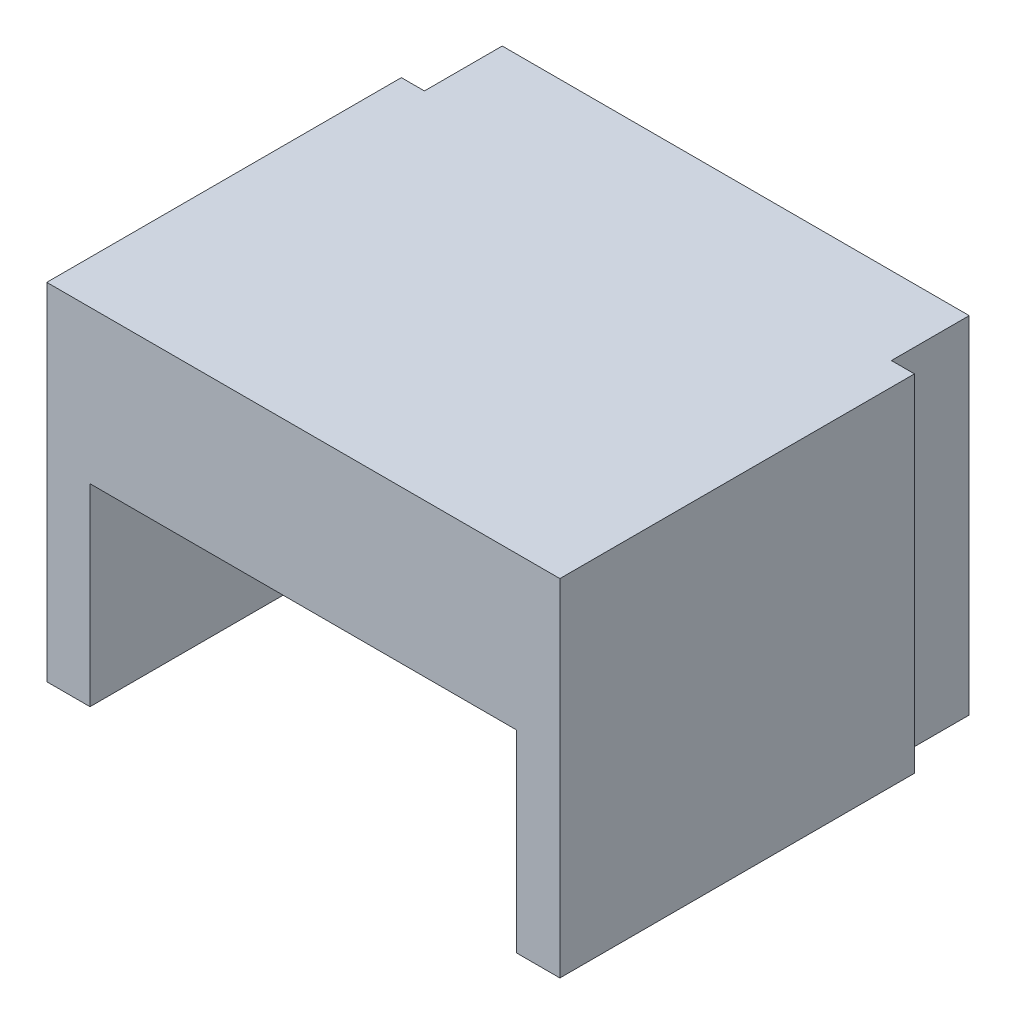
ISO-10303-21;
HEADER;
FILE_DESCRIPTION(('STEP AP214'),'2;1');
FILE_NAME('part.step','',(''),(''),'','','');
FILE_SCHEMA(('AUTOMOTIVE_DESIGN { 1 0 10303 214 1 1 1 1 }'));
ENDSEC;
DATA;
#1=APPLICATION_CONTEXT('core data for automotive mechanical design processes');
#2=APPLICATION_PROTOCOL_DEFINITION('international standard','automotive_design',2000,#1);
#3=PRODUCT_CONTEXT('',#1,'mechanical');
#4=PRODUCT('Part','Part','',(#3));
#5=PRODUCT_RELATED_PRODUCT_CATEGORY('part','',(#4));
#6=PRODUCT_DEFINITION_FORMATION('','',#4);
#7=PRODUCT_DEFINITION_CONTEXT('part definition',#1,'design');
#8=PRODUCT_DEFINITION('design','',#6,#7);
#9=PRODUCT_DEFINITION_SHAPE('','',#8);
#10=(LENGTH_UNIT() NAMED_UNIT(*) SI_UNIT(.MILLI.,.METRE.));
#11=(NAMED_UNIT(*) PLANE_ANGLE_UNIT() SI_UNIT($,.RADIAN.));
#12=(NAMED_UNIT(*) SI_UNIT($,.STERADIAN.) SOLID_ANGLE_UNIT());
#13=UNCERTAINTY_MEASURE_WITH_UNIT(LENGTH_MEASURE(1.E-05),#10,'distance_accuracy_value','');
#14=(GEOMETRIC_REPRESENTATION_CONTEXT(3) GLOBAL_UNCERTAINTY_ASSIGNED_CONTEXT((#13)) GLOBAL_UNIT_ASSIGNED_CONTEXT((#10,
#11,#12)) REPRESENTATION_CONTEXT('',''));
#15=CARTESIAN_POINT('',(0.,0.,0.));
#16=DIRECTION('',(0.,0.,1.));
#17=DIRECTION('',(1.,0.,0.));
#18=AXIS2_PLACEMENT_3D('',#15,#16,#17);
#19=CARTESIAN_POINT('',(0.,0.,15.));
#20=DIRECTION('',(0.,1.,0.));
#21=DIRECTION('',(0.,0.,1.));
#22=AXIS2_PLACEMENT_3D('',#19,#20,#21);
#23=PLANE('',#22);
#24=DIRECTION('',(-1.,0.,0.));
#25=VECTOR('',#24,1.);
#26=CARTESIAN_POINT('',(17.8,0.,2.7));
#27=LINE('',#26,#25);
#28=CARTESIAN_POINT('',(17.8,0.,2.7));
#29=VERTEX_POINT('',#28);
#30=CARTESIAN_POINT('',(17.,0.,2.7));
#31=VERTEX_POINT('',#30);
#32=EDGE_CURVE('E151',#29,#31,#27,.T.);
#33=ORIENTED_EDGE('',*,*,#32,.F.);
#34=DIRECTION('',(0.,0.,-1.));
#35=VECTOR('',#34,1.);
#36=CARTESIAN_POINT('',(17.8,0.,15.));
#37=LINE('',#36,#35);
#38=CARTESIAN_POINT('',(17.8,0.,15.));
#39=VERTEX_POINT('',#38);
#40=EDGE_CURVE('E51',#39,#29,#37,.T.);
#41=ORIENTED_EDGE('',*,*,#40,.F.);
#42=DIRECTION('',(1.,0.,0.));
#43=VECTOR('',#42,1.);
#44=CARTESIAN_POINT('',(0.,0.,15.));
#45=LINE('',#44,#43);
#46=CARTESIAN_POINT('',(16.3,0.,15.));
#47=VERTEX_POINT('',#46);
#48=EDGE_CURVE('E226',#47,#39,#45,.T.);
#49=ORIENTED_EDGE('',*,*,#48,.F.);
#50=DIRECTION('',(0.,0.,1.));
#51=VECTOR('',#50,1.);
#52=CARTESIAN_POINT('',(16.3,0.,0.));
#53=LINE('',#52,#51);
#54=CARTESIAN_POINT('',(16.3,0.,0.));
#55=VERTEX_POINT('',#54);
#56=EDGE_CURVE('E225',#55,#47,#53,.T.);
#57=ORIENTED_EDGE('',*,*,#56,.F.);
#58=DIRECTION('',(1.,0.,0.));
#59=VECTOR('',#58,1.);
#60=CARTESIAN_POINT('',(0.,0.,0.));
#61=LINE('',#60,#59);
#62=CARTESIAN_POINT('',(17.,0.,0.));
#63=VERTEX_POINT('',#62);
#64=EDGE_CURVE('E164',#55,#63,#61,.T.);
#65=ORIENTED_EDGE('',*,*,#64,.T.);
#66=DIRECTION('',(0.,0.,-1.));
#67=VECTOR('',#66,1.);
#68=CARTESIAN_POINT('',(17.,0.,2.7));
#69=LINE('',#68,#67);
#70=EDGE_CURVE('E144',#31,#63,#69,.T.);
#71=ORIENTED_EDGE('',*,*,#70,.F.);
#72=EDGE_LOOP('',(#33,#41,#49,#57,#65,#71));
#73=FACE_BOUND('',#72,.T.);
#74=ADVANCED_FACE('F43',(#73),#23,.F.);
#75=CARTESIAN_POINT('',(0.,0.,15.));
#76=DIRECTION('',(1.,0.,0.));
#77=DIRECTION('',(0.,0.,-1.));
#78=AXIS2_PLACEMENT_3D('',#75,#76,#77);
#79=PLANE('',#78);
#80=DIRECTION('',(0.,1.,0.));
#81=VECTOR('',#80,1.);
#82=CARTESIAN_POINT('',(0.,12.,2.7));
#83=LINE('',#82,#81);
#84=CARTESIAN_POINT('',(0.,0.,2.7));
#85=VERTEX_POINT('',#84);
#86=CARTESIAN_POINT('',(0.,12.,2.7));
#87=VERTEX_POINT('',#86);
#88=EDGE_CURVE('E171',#85,#87,#83,.T.);
#89=ORIENTED_EDGE('',*,*,#88,.F.);
#90=DIRECTION('',(0.,0.,-1.));
#91=VECTOR('',#90,1.);
#92=CARTESIAN_POINT('',(0.,0.,15.));
#93=LINE('',#92,#91);
#94=CARTESIAN_POINT('',(0.,0.,15.));
#95=VERTEX_POINT('',#94);
#96=EDGE_CURVE('E11',#95,#85,#93,.T.);
#97=ORIENTED_EDGE('',*,*,#96,.F.);
#98=DIRECTION('',(0.,-1.,0.));
#99=VECTOR('',#98,1.);
#100=CARTESIAN_POINT('',(0.,0.,15.));
#101=LINE('',#100,#99);
#102=CARTESIAN_POINT('',(0.,12.,15.));
#103=VERTEX_POINT('',#102);
#104=EDGE_CURVE('E227',#103,#95,#101,.T.);
#105=ORIENTED_EDGE('',*,*,#104,.F.);
#106=DIRECTION('',(0.,0.,-1.));
#107=VECTOR('',#106,1.);
#108=CARTESIAN_POINT('',(0.,12.,15.));
#109=LINE('',#108,#107);
#110=EDGE_CURVE('E236',#103,#87,#109,.T.);
#111=ORIENTED_EDGE('',*,*,#110,.T.);
#112=EDGE_LOOP('',(#89,#97,#105,#111));
#113=FACE_BOUND('',#112,.T.);
#114=ADVANCED_FACE('F44',(#113),#79,.F.);
#115=CARTESIAN_POINT('',(17.8,0.,15.));
#116=DIRECTION('',(-1.,0.,0.));
#117=DIRECTION('',(0.,0.,1.));
#118=AXIS2_PLACEMENT_3D('',#115,#116,#117);
#119=PLANE('',#118);
#120=DIRECTION('',(0.,-1.,0.));
#121=VECTOR('',#120,1.);
#122=CARTESIAN_POINT('',(17.8,12.,2.7));
#123=LINE('',#122,#121);
#124=CARTESIAN_POINT('',(17.8,12.,2.7));
#125=VERTEX_POINT('',#124);
#126=EDGE_CURVE('E156',#125,#29,#123,.T.);
#127=ORIENTED_EDGE('',*,*,#126,.F.);
#128=DIRECTION('',(0.,0.,-1.));
#129=VECTOR('',#128,1.);
#130=CARTESIAN_POINT('',(17.8,12.,15.));
#131=LINE('',#130,#129);
#132=CARTESIAN_POINT('',(17.8,12.,15.));
#133=VERTEX_POINT('',#132);
#134=EDGE_CURVE('E243',#133,#125,#131,.T.);
#135=ORIENTED_EDGE('',*,*,#134,.F.);
#136=DIRECTION('',(0.,1.,0.));
#137=VECTOR('',#136,1.);
#138=CARTESIAN_POINT('',(17.8,0.,15.));
#139=LINE('',#138,#137);
#140=EDGE_CURVE('E233',#39,#133,#139,.T.);
#141=ORIENTED_EDGE('',*,*,#140,.F.);
#142=ORIENTED_EDGE('',*,*,#40,.T.);
#143=EDGE_LOOP('',(#127,#135,#141,#142));
#144=FACE_BOUND('',#143,.T.);
#145=ADVANCED_FACE('F248',(#144),#119,.F.);
#146=CARTESIAN_POINT('',(0.,12.,15.));
#147=DIRECTION('',(0.,-1.,0.));
#148=DIRECTION('',(0.,0.,-1.));
#149=AXIS2_PLACEMENT_3D('',#146,#147,#148);
#150=PLANE('',#149);
#151=DIRECTION('',(1.,0.,0.));
#152=VECTOR('',#151,1.);
#153=CARTESIAN_POINT('',(17.8,12.,2.7));
#154=LINE('',#153,#152);
#155=CARTESIAN_POINT('',(17.,12.,2.7));
#156=VERTEX_POINT('',#155);
#157=EDGE_CURVE('E147',#156,#125,#154,.T.);
#158=ORIENTED_EDGE('',*,*,#157,.F.);
#159=DIRECTION('',(0.,0.,-1.));
#160=VECTOR('',#159,1.);
#161=CARTESIAN_POINT('',(17.,12.,2.7));
#162=LINE('',#161,#160);
#163=CARTESIAN_POINT('',(17.,12.,0.));
#164=VERTEX_POINT('',#163);
#165=EDGE_CURVE('E146',#156,#164,#162,.T.);
#166=ORIENTED_EDGE('',*,*,#165,.T.);
#167=DIRECTION('',(-1.,0.,0.));
#168=VECTOR('',#167,1.);
#169=CARTESIAN_POINT('',(0.,12.,0.));
#170=LINE('',#169,#168);
#171=CARTESIAN_POINT('',(0.800000000000002,12.,0.));
#172=VERTEX_POINT('',#171);
#173=EDGE_CURVE('E228',#164,#172,#170,.T.);
#174=ORIENTED_EDGE('',*,*,#173,.T.);
#175=DIRECTION('',(0.,0.,-1.));
#176=VECTOR('',#175,1.);
#177=CARTESIAN_POINT('',(0.800000000000002,12.,2.7));
#178=LINE('',#177,#176);
#179=CARTESIAN_POINT('',(0.800000000000002,12.,2.7));
#180=VERTEX_POINT('',#179);
#181=EDGE_CURVE('E175',#180,#172,#178,.T.);
#182=ORIENTED_EDGE('',*,*,#181,.F.);
#183=DIRECTION('',(1.,0.,0.));
#184=VECTOR('',#183,1.);
#185=CARTESIAN_POINT('',(0.,12.,2.7));
#186=LINE('',#185,#184);
#187=EDGE_CURVE('E66',#87,#180,#186,.T.);
#188=ORIENTED_EDGE('',*,*,#187,.F.);
#189=ORIENTED_EDGE('',*,*,#110,.F.);
#190=DIRECTION('',(-1.,0.,0.));
#191=VECTOR('',#190,1.);
#192=CARTESIAN_POINT('',(0.,12.,15.));
#193=LINE('',#192,#191);
#194=EDGE_CURVE('E237',#133,#103,#193,.T.);
#195=ORIENTED_EDGE('',*,*,#194,.F.);
#196=ORIENTED_EDGE('',*,*,#134,.T.);
#197=EDGE_LOOP('',(#158,#166,#174,#182,#188,#189,#195,#196));
#198=FACE_BOUND('',#197,.T.);
#199=ADVANCED_FACE('F270',(#198),#150,.F.);
#200=CARTESIAN_POINT('',(1.5,0.,0.));
#201=DIRECTION('',(-1.,0.,0.));
#202=DIRECTION('',(0.,0.,1.));
#203=AXIS2_PLACEMENT_3D('',#200,#201,#202);
#204=PLANE('',#203);
#205=DIRECTION('',(0.,1.,0.));
#206=VECTOR('',#205,1.);
#207=CARTESIAN_POINT('',(1.5,6.7,3.55001510292752));
#208=LINE('',#207,#206);
#209=CARTESIAN_POINT('',(1.5,6.7,3.55001510292752));
#210=VERTEX_POINT('',#209);
#211=CARTESIAN_POINT('',(1.5,7.5,3.55001510292752));
#212=VERTEX_POINT('',#211);
#213=EDGE_CURVE('E200',#210,#212,#208,.T.);
#214=ORIENTED_EDGE('',*,*,#213,.F.);
#215=DIRECTION('',(0.,0.,-1.));
#216=VECTOR('',#215,1.);
#217=CARTESIAN_POINT('',(1.5,6.7,15.));
#218=LINE('',#217,#216);
#219=CARTESIAN_POINT('',(1.5,6.7,15.));
#220=VERTEX_POINT('',#219);
#221=EDGE_CURVE('E187',#220,#210,#218,.T.);
#222=ORIENTED_EDGE('',*,*,#221,.F.);
#223=DIRECTION('',(0.,-1.,0.));
#224=VECTOR('',#223,1.);
#225=CARTESIAN_POINT('',(1.5,0.,15.));
#226=LINE('',#225,#224);
#227=CARTESIAN_POINT('',(1.5,0.,15.));
#228=VERTEX_POINT('',#227);
#229=EDGE_CURVE('E203',#220,#228,#226,.T.);
#230=ORIENTED_EDGE('',*,*,#229,.T.);
#231=DIRECTION('',(0.,0.,1.));
#232=VECTOR('',#231,1.);
#233=CARTESIAN_POINT('',(1.5,0.,0.));
#234=LINE('',#233,#232);
#235=CARTESIAN_POINT('',(1.5,0.,0.));
#236=VERTEX_POINT('',#235);
#237=EDGE_CURVE('E215',#236,#228,#234,.T.);
#238=ORIENTED_EDGE('',*,*,#237,.F.);
#239=DIRECTION('',(0.,-1.,0.));
#240=VECTOR('',#239,1.);
#241=CARTESIAN_POINT('',(1.5,0.,0.));
#242=LINE('',#241,#240);
#243=CARTESIAN_POINT('',(1.5,7.5,0.));
#244=VERTEX_POINT('',#243);
#245=EDGE_CURVE('E205',#244,#236,#242,.T.);
#246=ORIENTED_EDGE('',*,*,#245,.F.);
#247=DIRECTION('',(0.,0.,1.));
#248=VECTOR('',#247,1.);
#249=CARTESIAN_POINT('',(1.5,7.5,0.));
#250=LINE('',#249,#248);
#251=EDGE_CURVE('E216',#244,#212,#250,.T.);
#252=ORIENTED_EDGE('',*,*,#251,.T.);
#253=EDGE_LOOP('',(#214,#222,#230,#238,#246,#252));
#254=FACE_BOUND('',#253,.T.);
#255=ADVANCED_FACE('F282',(#254),#204,.F.);
#256=CARTESIAN_POINT('',(1.5,7.5,0.));
#257=DIRECTION('',(0.,1.,0.));
#258=DIRECTION('',(-1.,0.,0.));
#259=AXIS2_PLACEMENT_3D('',#256,#257,#258);
#260=PLANE('',#259);
#261=DIRECTION('',(1.,0.,0.));
#262=VECTOR('',#261,1.);
#263=CARTESIAN_POINT('',(1.5,7.5,3.55001510292752));
#264=LINE('',#263,#262);
#265=CARTESIAN_POINT('',(16.3,7.5,3.55001510292752));
#266=VERTEX_POINT('',#265);
#267=EDGE_CURVE('E170',#212,#266,#264,.T.);
#268=ORIENTED_EDGE('',*,*,#267,.F.);
#269=ORIENTED_EDGE('',*,*,#251,.F.);
#270=DIRECTION('',(-1.,0.,0.));
#271=VECTOR('',#270,1.);
#272=CARTESIAN_POINT('',(1.5,7.5,0.));
#273=LINE('',#272,#271);
#274=CARTESIAN_POINT('',(16.3,7.5,0.));
#275=VERTEX_POINT('',#274);
#276=EDGE_CURVE('E207',#275,#244,#273,.T.);
#277=ORIENTED_EDGE('',*,*,#276,.F.);
#278=DIRECTION('',(0.,0.,1.));
#279=VECTOR('',#278,1.);
#280=CARTESIAN_POINT('',(16.3,7.5,0.));
#281=LINE('',#280,#279);
#282=EDGE_CURVE('E218',#275,#266,#281,.T.);
#283=ORIENTED_EDGE('',*,*,#282,.T.);
#284=EDGE_LOOP('',(#268,#269,#277,#283));
#285=FACE_BOUND('',#284,.T.);
#286=ADVANCED_FACE('F348',(#285),#260,.F.);
#287=CARTESIAN_POINT('',(16.3,0.,0.));
#288=DIRECTION('',(1.,0.,0.));
#289=DIRECTION('',(0.,0.,-1.));
#290=AXIS2_PLACEMENT_3D('',#287,#288,#289);
#291=PLANE('',#290);
#292=DIRECTION('',(0.,0.,1.));
#293=VECTOR('',#292,1.);
#294=CARTESIAN_POINT('',(16.3,6.7,15.));
#295=LINE('',#294,#293);
#296=CARTESIAN_POINT('',(16.3,6.7,3.55001510292752));
#297=VERTEX_POINT('',#296);
#298=CARTESIAN_POINT('',(16.3,6.7,15.));
#299=VERTEX_POINT('',#298);
#300=EDGE_CURVE('E191',#297,#299,#295,.T.);
#301=ORIENTED_EDGE('',*,*,#300,.F.);
#302=DIRECTION('',(0.,1.,0.));
#303=VECTOR('',#302,1.);
#304=CARTESIAN_POINT('',(16.3,6.7,3.55001510292752));
#305=LINE('',#304,#303);
#306=EDGE_CURVE('E195',#297,#266,#305,.T.);
#307=ORIENTED_EDGE('',*,*,#306,.T.);
#308=ORIENTED_EDGE('',*,*,#282,.F.);
#309=DIRECTION('',(0.,1.,0.));
#310=VECTOR('',#309,1.);
#311=CARTESIAN_POINT('',(16.3,0.,0.));
#312=LINE('',#311,#310);
#313=EDGE_CURVE('E202',#55,#275,#312,.T.);
#314=ORIENTED_EDGE('',*,*,#313,.F.);
#315=ORIENTED_EDGE('',*,*,#56,.T.);
#316=DIRECTION('',(0.,1.,0.));
#317=VECTOR('',#316,1.);
#318=CARTESIAN_POINT('',(16.3,0.,15.));
#319=LINE('',#318,#317);
#320=EDGE_CURVE('E206',#47,#299,#319,.T.);
#321=ORIENTED_EDGE('',*,*,#320,.T.);
#322=EDGE_LOOP('',(#301,#307,#308,#314,#315,#321));
#323=FACE_BOUND('',#322,.T.);
#324=ADVANCED_FACE('F259',(#323),#291,.F.);
#325=CARTESIAN_POINT('',(0.,0.,15.));
#326=DIRECTION('',(0.,0.,-1.));
#327=DIRECTION('',(-1.,0.,0.));
#328=AXIS2_PLACEMENT_3D('',#325,#326,#327);
#329=PLANE('',#328);
#330=ORIENTED_EDGE('',*,*,#229,.F.);
#331=DIRECTION('',(-1.,0.,0.));
#332=VECTOR('',#331,1.);
#333=CARTESIAN_POINT('',(1.5,6.7,15.));
#334=LINE('',#333,#332);
#335=EDGE_CURVE('E194',#299,#220,#334,.T.);
#336=ORIENTED_EDGE('',*,*,#335,.F.);
#337=ORIENTED_EDGE('',*,*,#320,.F.);
#338=ORIENTED_EDGE('',*,*,#48,.T.);
#339=ORIENTED_EDGE('',*,*,#140,.T.);
#340=ORIENTED_EDGE('',*,*,#194,.T.);
#341=ORIENTED_EDGE('',*,*,#104,.T.);
#342=EDGE_CURVE('E231',#95,#228,#45,.T.);
#343=ORIENTED_EDGE('',*,*,#342,.T.);
#344=EDGE_LOOP('',(#330,#336,#337,#338,#339,#340,#341,#343));
#345=FACE_BOUND('',#344,.T.);
#346=ADVANCED_FACE('F254',(#345),#329,.F.);
#347=CARTESIAN_POINT('',(0.,0.,0.));
#348=DIRECTION('',(0.,0.,-1.));
#349=DIRECTION('',(-1.,0.,0.));
#350=AXIS2_PLACEMENT_3D('',#347,#348,#349);
#351=PLANE('',#350);
#352=DIRECTION('',(0.,1.,0.));
#353=VECTOR('',#352,1.);
#354=CARTESIAN_POINT('',(17.,0.,0.));
#355=LINE('',#354,#353);
#356=EDGE_CURVE('E159',#63,#164,#355,.T.);
#357=ORIENTED_EDGE('',*,*,#356,.F.);
#358=ORIENTED_EDGE('',*,*,#64,.F.);
#359=ORIENTED_EDGE('',*,*,#313,.T.);
#360=ORIENTED_EDGE('',*,*,#276,.T.);
#361=ORIENTED_EDGE('',*,*,#245,.T.);
#362=CARTESIAN_POINT('',(0.800000000000002,0.,0.));
#363=VERTEX_POINT('',#362);
#364=EDGE_CURVE('E239',#363,#236,#61,.T.);
#365=ORIENTED_EDGE('',*,*,#364,.F.);
#366=DIRECTION('',(0.,-1.,0.));
#367=VECTOR('',#366,1.);
#368=CARTESIAN_POINT('',(0.800000000000002,0.,0.));
#369=LINE('',#368,#367);
#370=EDGE_CURVE('E179',#172,#363,#369,.T.);
#371=ORIENTED_EDGE('',*,*,#370,.F.);
#372=ORIENTED_EDGE('',*,*,#173,.F.);
#373=EDGE_LOOP('',(#357,#358,#359,#360,#361,#365,#371,#372));
#374=FACE_BOUND('',#373,.T.);
#375=ADVANCED_FACE('F265',(#374),#351,.T.);
#376=DIRECTION('',(-1.,0.,0.));
#377=VECTOR('',#376,1.);
#378=CARTESIAN_POINT('',(0.,0.,2.7));
#379=LINE('',#378,#377);
#380=CARTESIAN_POINT('',(0.800000000000002,0.,2.7));
#381=VERTEX_POINT('',#380);
#382=EDGE_CURVE('E182',#381,#85,#379,.T.);
#383=ORIENTED_EDGE('',*,*,#382,.F.);
#384=DIRECTION('',(0.,0.,-1.));
#385=VECTOR('',#384,1.);
#386=CARTESIAN_POINT('',(0.800000000000002,0.,2.7));
#387=LINE('',#386,#385);
#388=EDGE_CURVE('E173',#381,#363,#387,.T.);
#389=ORIENTED_EDGE('',*,*,#388,.T.);
#390=ORIENTED_EDGE('',*,*,#364,.T.);
#391=ORIENTED_EDGE('',*,*,#237,.T.);
#392=ORIENTED_EDGE('',*,*,#342,.F.);
#393=ORIENTED_EDGE('',*,*,#96,.T.);
#394=EDGE_LOOP('',(#383,#389,#390,#391,#392,#393));
#395=FACE_BOUND('',#394,.T.);
#396=ADVANCED_FACE('F277',(#395),#23,.F.);
#397=CARTESIAN_POINT('',(1.5,6.7,3.55001510292752));
#398=DIRECTION('',(0.,0.,1.));
#399=DIRECTION('',(1.,0.,0.));
#400=AXIS2_PLACEMENT_3D('',#397,#398,#399);
#401=PLANE('',#400);
#402=ORIENTED_EDGE('',*,*,#267,.T.);
#403=ORIENTED_EDGE('',*,*,#306,.F.);
#404=DIRECTION('',(1.,0.,0.));
#405=VECTOR('',#404,1.);
#406=CARTESIAN_POINT('',(1.5,6.7,3.55001510292752));
#407=LINE('',#406,#405);
#408=EDGE_CURVE('E186',#210,#297,#407,.T.);
#409=ORIENTED_EDGE('',*,*,#408,.F.);
#410=ORIENTED_EDGE('',*,*,#213,.T.);
#411=EDGE_LOOP('',(#402,#403,#409,#410));
#412=FACE_BOUND('',#411,.T.);
#413=ADVANCED_FACE('F305',(#412),#401,.F.);
#414=CARTESIAN_POINT('',(0.,6.7,0.));
#415=DIRECTION('',(0.,-1.,0.));
#416=DIRECTION('',(1.,0.,0.));
#417=AXIS2_PLACEMENT_3D('',#414,#415,#416);
#418=PLANE('',#417);
#419=ORIENTED_EDGE('',*,*,#221,.T.);
#420=ORIENTED_EDGE('',*,*,#408,.T.);
#421=ORIENTED_EDGE('',*,*,#300,.T.);
#422=ORIENTED_EDGE('',*,*,#335,.T.);
#423=EDGE_LOOP('',(#419,#420,#421,#422));
#424=FACE_BOUND('',#423,.T.);
#425=ADVANCED_FACE('F293',(#424),#418,.T.);
#426=CARTESIAN_POINT('',(0.800000000000002,0.,2.7));
#427=DIRECTION('',(1.,0.,0.));
#428=DIRECTION('',(0.,0.,-1.));
#429=AXIS2_PLACEMENT_3D('',#426,#427,#428);
#430=PLANE('',#429);
#431=ORIENTED_EDGE('',*,*,#370,.T.);
#432=ORIENTED_EDGE('',*,*,#388,.F.);
#433=DIRECTION('',(0.,-1.,0.));
#434=VECTOR('',#433,1.);
#435=CARTESIAN_POINT('',(0.800000000000002,0.,2.7));
#436=LINE('',#435,#434);
#437=EDGE_CURVE('E181',#180,#381,#436,.T.);
#438=ORIENTED_EDGE('',*,*,#437,.F.);
#439=ORIENTED_EDGE('',*,*,#181,.T.);
#440=EDGE_LOOP('',(#431,#432,#438,#439));
#441=FACE_BOUND('',#440,.T.);
#442=ADVANCED_FACE('F286',(#441),#430,.F.);
#443=CARTESIAN_POINT('',(0.,0.,2.7));
#444=DIRECTION('',(0.,0.,1.));
#445=DIRECTION('',(1.,0.,0.));
#446=AXIS2_PLACEMENT_3D('',#443,#444,#445);
#447=PLANE('',#446);
#448=ORIENTED_EDGE('',*,*,#187,.T.);
#449=ORIENTED_EDGE('',*,*,#437,.T.);
#450=ORIENTED_EDGE('',*,*,#382,.T.);
#451=ORIENTED_EDGE('',*,*,#88,.T.);
#452=EDGE_LOOP('',(#448,#449,#450,#451));
#453=FACE_BOUND('',#452,.T.);
#454=ADVANCED_FACE('F287',(#453),#447,.F.);
#455=CARTESIAN_POINT('',(17.,0.,2.7));
#456=DIRECTION('',(-1.,0.,0.));
#457=DIRECTION('',(0.,0.,1.));
#458=AXIS2_PLACEMENT_3D('',#455,#456,#457);
#459=PLANE('',#458);
#460=ORIENTED_EDGE('',*,*,#356,.T.);
#461=ORIENTED_EDGE('',*,*,#165,.F.);
#462=DIRECTION('',(0.,1.,0.));
#463=VECTOR('',#462,1.);
#464=CARTESIAN_POINT('',(17.,0.,2.7));
#465=LINE('',#464,#463);
#466=EDGE_CURVE('E59',#31,#156,#465,.T.);
#467=ORIENTED_EDGE('',*,*,#466,.F.);
#468=ORIENTED_EDGE('',*,*,#70,.T.);
#469=EDGE_LOOP('',(#460,#461,#467,#468));
#470=FACE_BOUND('',#469,.T.);
#471=ADVANCED_FACE('F141',(#470),#459,.F.);
#472=CARTESIAN_POINT('',(0.,0.,2.7));
#473=DIRECTION('',(0.,0.,-1.));
#474=DIRECTION('',(-1.,0.,0.));
#475=AXIS2_PLACEMENT_3D('',#472,#473,#474);
#476=PLANE('',#475);
#477=ORIENTED_EDGE('',*,*,#32,.T.);
#478=ORIENTED_EDGE('',*,*,#466,.T.);
#479=ORIENTED_EDGE('',*,*,#157,.T.);
#480=ORIENTED_EDGE('',*,*,#126,.T.);
#481=EDGE_LOOP('',(#477,#478,#479,#480));
#482=FACE_BOUND('',#481,.T.);
#483=ADVANCED_FACE('F152',(#482),#476,.T.);
#484=CLOSED_SHELL('',(#74,#114,#145,#199,#255,#286,#324,#346,#375,#396,#413,#425,#442,#454,#471,#483));
#485=MANIFOLD_SOLID_BREP('B2',#484);
#486=ADVANCED_BREP_SHAPE_REPRESENTATION('',(#18,#485),#14);
#487=SHAPE_DEFINITION_REPRESENTATION(#9,#486);
ENDSEC;
END-ISO-10303-21;
